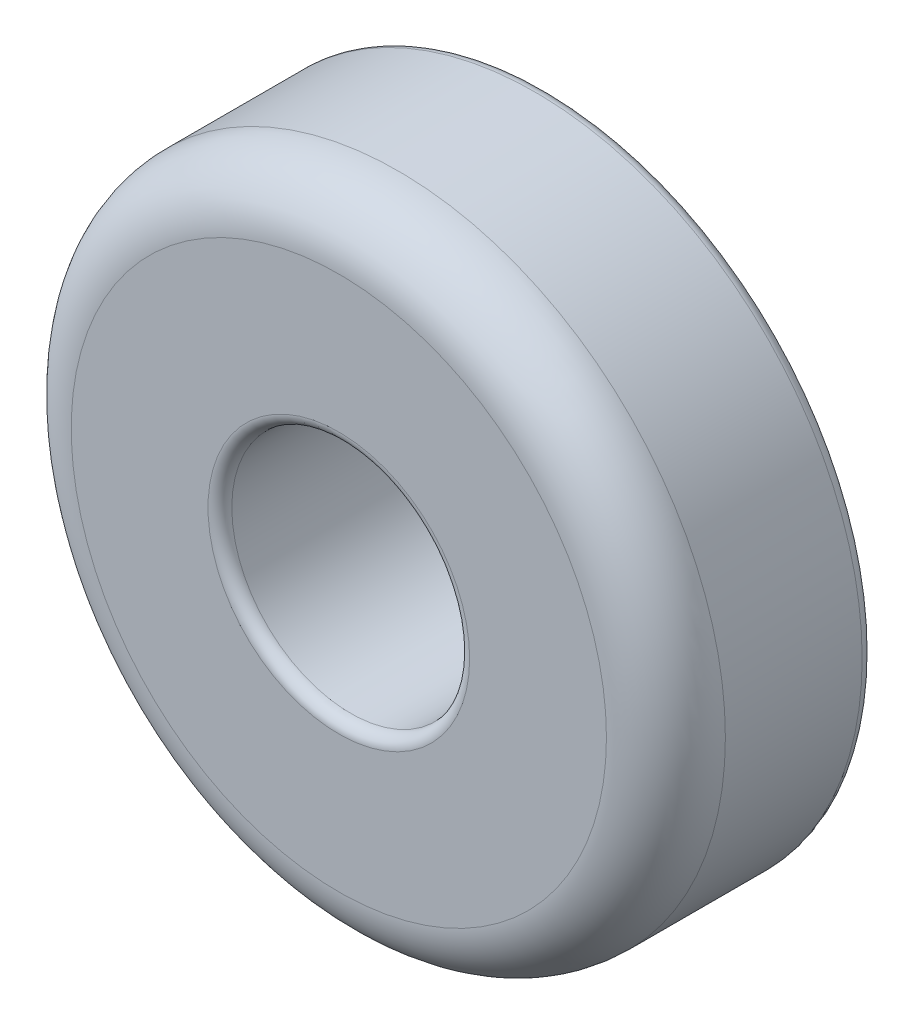
ISO-10303-21;
HEADER;
FILE_DESCRIPTION(('STEP AP214'),'2;1');
FILE_NAME('part.step','',(''),(''),'','','');
FILE_SCHEMA(('AUTOMOTIVE_DESIGN { 1 0 10303 214 1 1 1 1 }'));
ENDSEC;
DATA;
#1=APPLICATION_CONTEXT('core data for automotive mechanical design processes');
#2=APPLICATION_PROTOCOL_DEFINITION('international standard','automotive_design',2000,#1);
#3=PRODUCT_CONTEXT('',#1,'mechanical');
#4=PRODUCT('Part','Part','',(#3));
#5=PRODUCT_RELATED_PRODUCT_CATEGORY('part','',(#4));
#6=PRODUCT_DEFINITION_FORMATION('','',#4);
#7=PRODUCT_DEFINITION_CONTEXT('part definition',#1,'design');
#8=PRODUCT_DEFINITION('design','',#6,#7);
#9=PRODUCT_DEFINITION_SHAPE('','',#8);
#10=(LENGTH_UNIT() NAMED_UNIT(*) SI_UNIT(.MILLI.,.METRE.));
#11=(NAMED_UNIT(*) PLANE_ANGLE_UNIT() SI_UNIT($,.RADIAN.));
#12=(NAMED_UNIT(*) SI_UNIT($,.STERADIAN.) SOLID_ANGLE_UNIT());
#13=UNCERTAINTY_MEASURE_WITH_UNIT(LENGTH_MEASURE(1.E-05),#10,'distance_accuracy_value','');
#14=(GEOMETRIC_REPRESENTATION_CONTEXT(3) GLOBAL_UNCERTAINTY_ASSIGNED_CONTEXT((#13)) GLOBAL_UNIT_ASSIGNED_CONTEXT((#10,
#11,#12)) REPRESENTATION_CONTEXT('',''));
#15=CARTESIAN_POINT('',(0.,0.,0.));
#16=DIRECTION('',(0.,0.,1.));
#17=DIRECTION('',(1.,0.,0.));
#18=AXIS2_PLACEMENT_3D('',#15,#16,#17);
#19=CARTESIAN_POINT('',(0.,0.,1.25417158622879));
#20=DIRECTION('',(0.,0.,1.));
#21=DIRECTION('',(1.,0.,0.));
#22=AXIS2_PLACEMENT_3D('',#19,#20,#21);
#23=PLANE('',#22);
#24=CARTESIAN_POINT('',(0.,0.,1.25417158622879));
#25=DIRECTION('',(0.,0.,1.));
#26=DIRECTION('',(1.,0.,0.));
#27=AXIS2_PLACEMENT_3D('',#24,#25,#26);
#28=CIRCLE('',#27,0.4895);
#29=CARTESIAN_POINT('',(0.4895,0.,1.25417158622879));
#30=VERTEX_POINT('',#29);
#31=EDGE_CURVE('E11',#30,#30,#28,.F.);
#32=ORIENTED_EDGE('',*,*,#31,.T.);
#33=EDGE_LOOP('',(#32));
#34=FACE_BOUND('',#33,.T.);
#35=CARTESIAN_POINT('',(0.,0.,1.25417158622879));
#36=DIRECTION('',(0.,0.,1.));
#37=DIRECTION('',(1.,0.,0.));
#38=AXIS2_PLACEMENT_3D('',#35,#36,#37);
#39=CIRCLE('',#38,1.00125);
#40=CARTESIAN_POINT('',(1.00125,0.,1.25417158622879));
#41=VERTEX_POINT('',#40);
#42=EDGE_CURVE('E76',#41,#41,#39,.T.);
#43=ORIENTED_EDGE('',*,*,#42,.T.);
#44=EDGE_LOOP('',(#43));
#45=FACE_BOUND('',#44,.T.);
#46=ADVANCED_FACE('F50',(#34,#45),#23,.T.);
#47=CARTESIAN_POINT('',(0.,0.,0.47542158622879));
#48=DIRECTION('',(0.,0.,1.));
#49=DIRECTION('',(1.,0.,0.));
#50=AXIS2_PLACEMENT_3D('',#47,#48,#49);
#51=PLANE('',#50);
#52=CARTESIAN_POINT('',(0.,0.,0.47542158622879));
#53=DIRECTION('',(0.,0.,1.));
#54=DIRECTION('',(1.,0.,0.));
#55=AXIS2_PLACEMENT_3D('',#52,#53,#54);
#56=CIRCLE('',#55,0.4895);
#57=CARTESIAN_POINT('',(0.4895,0.,0.47542158622879));
#58=VERTEX_POINT('',#57);
#59=EDGE_CURVE('E69',#58,#58,#56,.T.);
#60=ORIENTED_EDGE('',*,*,#59,.T.);
#61=EDGE_LOOP('',(#60));
#62=FACE_BOUND('',#61,.T.);
#63=CARTESIAN_POINT('',(0.,0.,0.47542158622879));
#64=DIRECTION('',(0.,0.,1.));
#65=DIRECTION('',(1.,0.,0.));
#66=AXIS2_PLACEMENT_3D('',#63,#64,#65);
#67=CIRCLE('',#66,1.17925);
#68=CARTESIAN_POINT('',(1.17925,0.,0.47542158622879));
#69=VERTEX_POINT('',#68);
#70=EDGE_CURVE('E66',#69,#69,#67,.F.);
#71=ORIENTED_EDGE('',*,*,#70,.T.);
#72=EDGE_LOOP('',(#71));
#73=FACE_BOUND('',#72,.T.);
#74=ADVANCED_FACE('F99',(#62,#73),#51,.F.);
#75=CARTESIAN_POINT('',(0.,0.,1.25417158622879));
#76=DIRECTION('',(0.,0.,-1.));
#77=DIRECTION('',(-1.,0.,0.));
#78=AXIS2_PLACEMENT_3D('',#75,#76,#77);
#79=CYLINDRICAL_SURFACE('',#78,1.22375);
#80=CARTESIAN_POINT('',(0.,0.,0.51992158622879));
#81=DIRECTION('',(0.,0.,1.));
#82=DIRECTION('',(1.,0.,0.));
#83=AXIS2_PLACEMENT_3D('',#80,#81,#82);
#84=CIRCLE('',#83,1.22375);
#85=CARTESIAN_POINT('',(1.22375,0.,0.51992158622879));
#86=VERTEX_POINT('',#85);
#87=EDGE_CURVE('E53',#86,#86,#84,.T.);
#88=ORIENTED_EDGE('',*,*,#87,.T.);
#89=EDGE_LOOP('',(#88));
#90=FACE_BOUND('',#89,.T.);
#91=CARTESIAN_POINT('',(0.,0.,1.03167158622879));
#92=DIRECTION('',(0.,0.,1.));
#93=DIRECTION('',(1.,0.,0.));
#94=AXIS2_PLACEMENT_3D('',#91,#92,#93);
#95=CIRCLE('',#94,1.22375);
#96=CARTESIAN_POINT('',(1.22375,0.,1.03167158622879));
#97=VERTEX_POINT('',#96);
#98=EDGE_CURVE('E71',#97,#97,#95,.F.);
#99=ORIENTED_EDGE('',*,*,#98,.T.);
#100=EDGE_LOOP('',(#99));
#101=FACE_BOUND('',#100,.T.);
#102=ADVANCED_FACE('F94',(#90,#101),#79,.T.);
#103=CARTESIAN_POINT('',(0.,0.,1.25417158622879));
#104=DIRECTION('',(0.,0.,-1.));
#105=DIRECTION('',(-1.,0.,0.));
#106=AXIS2_PLACEMENT_3D('',#103,#104,#105);
#107=CYLINDRICAL_SURFACE('',#106,0.445);
#108=CARTESIAN_POINT('',(0.,0.,0.51992158622879));
#109=DIRECTION('',(0.,0.,1.));
#110=DIRECTION('',(1.,0.,0.));
#111=AXIS2_PLACEMENT_3D('',#108,#109,#110);
#112=CIRCLE('',#111,0.445);
#113=CARTESIAN_POINT('',(0.445,0.,0.51992158622879));
#114=VERTEX_POINT('',#113);
#115=EDGE_CURVE('E59',#114,#114,#112,.F.);
#116=ORIENTED_EDGE('',*,*,#115,.T.);
#117=EDGE_LOOP('',(#116));
#118=FACE_BOUND('',#117,.T.);
#119=CARTESIAN_POINT('',(0.,0.,1.20967158622879));
#120=DIRECTION('',(0.,0.,1.));
#121=DIRECTION('',(1.,0.,0.));
#122=AXIS2_PLACEMENT_3D('',#119,#120,#121);
#123=CIRCLE('',#122,0.445);
#124=CARTESIAN_POINT('',(0.445,0.,1.20967158622879));
#125=VERTEX_POINT('',#124);
#126=EDGE_CURVE('E65',#125,#125,#123,.T.);
#127=ORIENTED_EDGE('',*,*,#126,.T.);
#128=EDGE_LOOP('',(#127));
#129=FACE_BOUND('',#128,.T.);
#130=ADVANCED_FACE('F85',(#118,#129),#107,.F.);
#131=CARTESIAN_POINT('',(0.,0.,1.03167158622879));
#132=DIRECTION('',(0.,0.,1.));
#133=DIRECTION('',(1.,0.,0.));
#134=AXIS2_PLACEMENT_3D('',#131,#132,#133);
#135=TOROIDAL_SURFACE('',#134,1.00125,0.2225);
#136=ORIENTED_EDGE('',*,*,#98,.F.);
#137=EDGE_LOOP('',(#136));
#138=FACE_BOUND('',#137,.T.);
#139=ORIENTED_EDGE('',*,*,#42,.F.);
#140=EDGE_LOOP('',(#139));
#141=FACE_BOUND('',#140,.T.);
#142=ADVANCED_FACE('F83',(#138,#141),#135,.T.);
#143=CARTESIAN_POINT('',(0.,0.,0.51992158622879));
#144=DIRECTION('',(0.,0.,1.));
#145=DIRECTION('',(1.,0.,0.));
#146=AXIS2_PLACEMENT_3D('',#143,#144,#145);
#147=TOROIDAL_SURFACE('',#146,0.4895,0.0445);
#148=ORIENTED_EDGE('',*,*,#115,.F.);
#149=EDGE_LOOP('',(#148));
#150=FACE_BOUND('',#149,.T.);
#151=ORIENTED_EDGE('',*,*,#59,.F.);
#152=EDGE_LOOP('',(#151));
#153=FACE_BOUND('',#152,.T.);
#154=ADVANCED_FACE('F82',(#150,#153),#147,.T.);
#155=CARTESIAN_POINT('',(0.,0.,0.51992158622879));
#156=DIRECTION('',(0.,0.,1.));
#157=DIRECTION('',(1.,0.,0.));
#158=AXIS2_PLACEMENT_3D('',#155,#156,#157);
#159=TOROIDAL_SURFACE('',#158,1.17925,0.0445);
#160=ORIENTED_EDGE('',*,*,#70,.F.);
#161=EDGE_LOOP('',(#160));
#162=FACE_BOUND('',#161,.T.);
#163=ORIENTED_EDGE('',*,*,#87,.F.);
#164=EDGE_LOOP('',(#163));
#165=FACE_BOUND('',#164,.T.);
#166=ADVANCED_FACE('F93',(#162,#165),#159,.T.);
#167=CARTESIAN_POINT('',(0.,0.,1.20967158622879));
#168=DIRECTION('',(0.,0.,1.));
#169=DIRECTION('',(1.,0.,0.));
#170=AXIS2_PLACEMENT_3D('',#167,#168,#169);
#171=TOROIDAL_SURFACE('',#170,0.4895,0.0445);
#172=ORIENTED_EDGE('',*,*,#31,.F.);
#173=EDGE_LOOP('',(#172));
#174=FACE_BOUND('',#173,.T.);
#175=ORIENTED_EDGE('',*,*,#126,.F.);
#176=EDGE_LOOP('',(#175));
#177=FACE_BOUND('',#176,.T.);
#178=ADVANCED_FACE('F47',(#174,#177),#171,.T.);
#179=CLOSED_SHELL('',(#46,#74,#102,#130,#142,#154,#166,#178));
#180=MANIFOLD_SOLID_BREP('B2',#179);
#181=ADVANCED_BREP_SHAPE_REPRESENTATION('',(#18,#180),#14);
#182=SHAPE_DEFINITION_REPRESENTATION(#9,#181);
ENDSEC;
END-ISO-10303-21;
